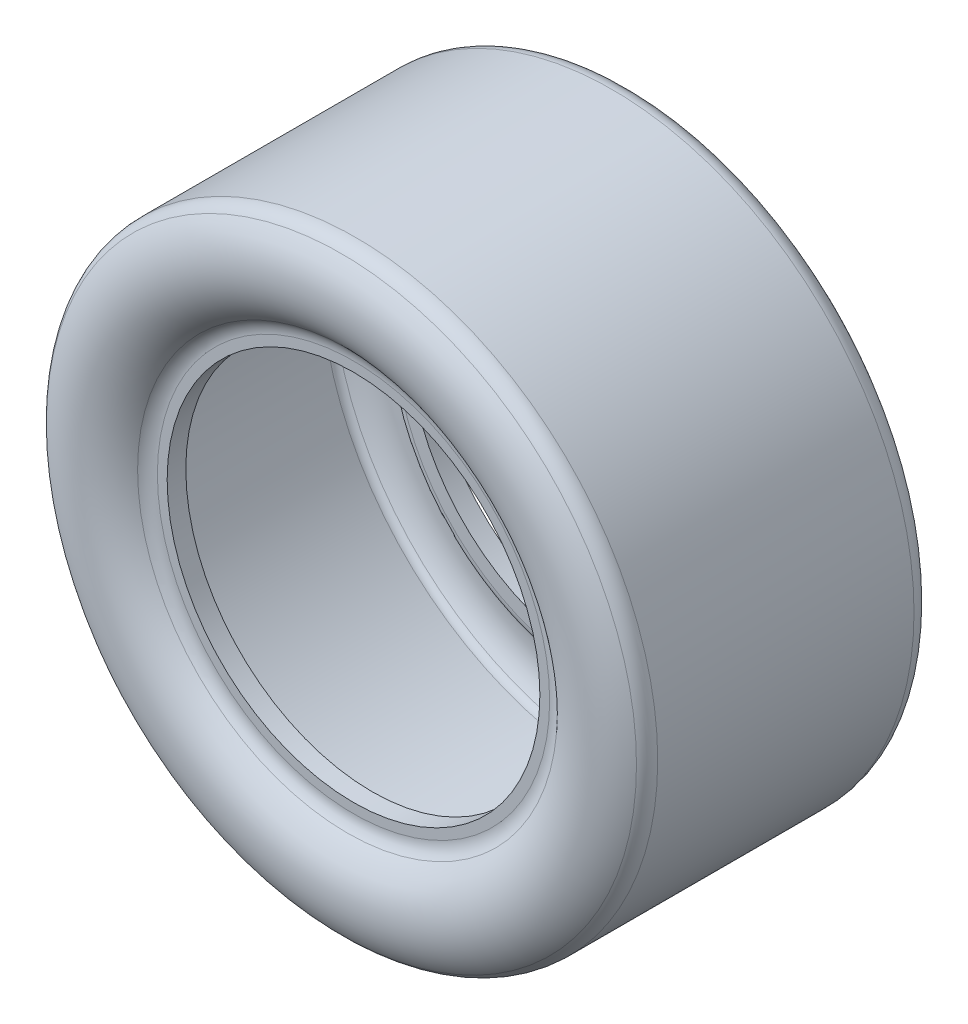
ISO-10303-21;
HEADER;
FILE_DESCRIPTION(('STEP AP214'),'2;1');
FILE_NAME('part.step','',(''),(''),'','','');
FILE_SCHEMA(('AUTOMOTIVE_DESIGN { 1 0 10303 214 1 1 1 1 }'));
ENDSEC;
DATA;
#1=APPLICATION_CONTEXT('core data for automotive mechanical design processes');
#2=APPLICATION_PROTOCOL_DEFINITION('international standard','automotive_design',2000,#1);
#3=PRODUCT_CONTEXT('',#1,'mechanical');
#4=PRODUCT('Part','Part','',(#3));
#5=PRODUCT_RELATED_PRODUCT_CATEGORY('part','',(#4));
#6=PRODUCT_DEFINITION_FORMATION('','',#4);
#7=PRODUCT_DEFINITION_CONTEXT('part definition',#1,'design');
#8=PRODUCT_DEFINITION('design','',#6,#7);
#9=PRODUCT_DEFINITION_SHAPE('','',#8);
#10=(LENGTH_UNIT() NAMED_UNIT(*) SI_UNIT(.MILLI.,.METRE.));
#11=(NAMED_UNIT(*) PLANE_ANGLE_UNIT() SI_UNIT($,.RADIAN.));
#12=(NAMED_UNIT(*) SI_UNIT($,.STERADIAN.) SOLID_ANGLE_UNIT());
#13=UNCERTAINTY_MEASURE_WITH_UNIT(LENGTH_MEASURE(1.E-05),#10,'distance_accuracy_value','');
#14=(GEOMETRIC_REPRESENTATION_CONTEXT(3) GLOBAL_UNCERTAINTY_ASSIGNED_CONTEXT((#13)) GLOBAL_UNIT_ASSIGNED_CONTEXT((#10,
#11,#12)) REPRESENTATION_CONTEXT('',''));
#15=CARTESIAN_POINT('',(0.,0.,0.));
#16=DIRECTION('',(0.,0.,1.));
#17=DIRECTION('',(1.,0.,0.));
#18=AXIS2_PLACEMENT_3D('',#15,#16,#17);
#19=CARTESIAN_POINT('',(0.,0.,64.4017));
#20=DIRECTION('',(0.,0.,-1.));
#21=DIRECTION('',(-1.,0.,0.));
#22=AXIS2_PLACEMENT_3D('',#19,#20,#21);
#23=TOROIDAL_SURFACE('',#22,174.243267307692,42.3486011478618);
#24=CARTESIAN_POINT('',(0.,0.,97.1518352972636));
#25=DIRECTION('',(0.,0.,-1.));
#26=DIRECTION('',(-1.,0.,0.));
#27=AXIS2_PLACEMENT_3D('',#24,#25,#26);
#28=CIRCLE('',#27,201.091594205129);
#29=CARTESIAN_POINT('',(-201.091594205129,0.,97.1518352972636));
#30=VERTEX_POINT('',#29);
#31=EDGE_CURVE('E54',#30,#30,#28,.F.);
#32=ORIENTED_EDGE('',*,*,#31,.T.);
#33=EDGE_LOOP('',(#32));
#34=FACE_BOUND('',#33,.T.);
#35=CARTESIAN_POINT('',(0.,0.,93.0181577706021));
#36=DIRECTION('',(0.,0.,-1.));
#37=DIRECTION('',(-1.,0.,0.));
#38=AXIS2_PLACEMENT_3D('',#35,#36,#37);
#39=CIRCLE('',#38,143.026246888632);
#40=CARTESIAN_POINT('',(-143.026246888632,0.,93.0181577706021));
#41=VERTEX_POINT('',#40);
#42=EDGE_CURVE('E58',#41,#41,#39,.T.);
#43=ORIENTED_EDGE('',*,*,#42,.T.);
#44=EDGE_LOOP('',(#43));
#45=FACE_BOUND('',#44,.T.);
#46=ADVANCED_FACE('F43',(#34,#45),#23,.T.);
#47=CARTESIAN_POINT('',(0.,127.,88.9));
#48=DIRECTION('',(0.,0.,1.));
#49=DIRECTION('',(1.,0.,0.));
#50=AXIS2_PLACEMENT_3D('',#47,#48,#49);
#51=PLANE('',#50);
#52=CARTESIAN_POINT('',(0.,0.,88.9));
#53=DIRECTION('',(0.,0.,1.));
#54=DIRECTION('',(1.,0.,0.));
#55=AXIS2_PLACEMENT_3D('',#52,#53,#54);
#56=CIRCLE('',#55,133.664517136619);
#57=CARTESIAN_POINT('',(133.664517136619,0.,88.9));
#58=VERTEX_POINT('',#57);
#59=EDGE_CURVE('E10',#58,#58,#56,.T.);
#60=ORIENTED_EDGE('',*,*,#59,.T.);
#61=EDGE_LOOP('',(#60));
#62=FACE_BOUND('',#61,.T.);
#63=CARTESIAN_POINT('',(0.,0.,88.9));
#64=DIRECTION('',(0.,0.,-1.));
#65=DIRECTION('',(-1.,0.,0.));
#66=AXIS2_PLACEMENT_3D('',#63,#64,#65);
#67=CIRCLE('',#66,127.);
#68=CARTESIAN_POINT('',(-127.,0.,88.9));
#69=VERTEX_POINT('',#68);
#70=EDGE_CURVE('E75',#69,#69,#67,.T.);
#71=ORIENTED_EDGE('',*,*,#70,.T.);
#72=EDGE_LOOP('',(#71));
#73=FACE_BOUND('',#72,.T.);
#74=ADVANCED_FACE('F130',(#62,#73),#51,.T.);
#75=CARTESIAN_POINT('',(0.,0.,0.));
#76=DIRECTION('',(0.,0.,-1.));
#77=DIRECTION('',(-1.,0.,0.));
#78=AXIS2_PLACEMENT_3D('',#75,#76,#77);
#79=CYLINDRICAL_SURFACE('',#78,127.);
#80=CARTESIAN_POINT('',(0.,0.,76.2));
#81=DIRECTION('',(0.,0.,-1.));
#82=DIRECTION('',(-1.,0.,0.));
#83=AXIS2_PLACEMENT_3D('',#80,#81,#82);
#84=CIRCLE('',#83,127.);
#85=CARTESIAN_POINT('',(-127.,0.,76.2));
#86=VERTEX_POINT('',#85);
#87=EDGE_CURVE('E78',#86,#86,#84,.T.);
#88=ORIENTED_EDGE('',*,*,#87,.T.);
#89=EDGE_LOOP('',(#88));
#90=FACE_BOUND('',#89,.T.);
#91=ORIENTED_EDGE('',*,*,#70,.F.);
#92=EDGE_LOOP('',(#91));
#93=FACE_BOUND('',#92,.T.);
#94=ADVANCED_FACE('F135',(#90,#93),#79,.F.);
#95=CARTESIAN_POINT('',(0.,127.,76.2));
#96=DIRECTION('',(0.,0.,-1.));
#97=DIRECTION('',(-1.,0.,0.));
#98=AXIS2_PLACEMENT_3D('',#95,#96,#97);
#99=PLANE('',#98);
#100=CARTESIAN_POINT('',(0.,0.,76.2));
#101=DIRECTION('',(0.,0.,-1.));
#102=DIRECTION('',(-1.,0.,0.));
#103=AXIS2_PLACEMENT_3D('',#100,#101,#102);
#104=CIRCLE('',#103,136.774584150412);
#105=CARTESIAN_POINT('',(-136.774584150412,0.,76.2));
#106=VERTEX_POINT('',#105);
#107=EDGE_CURVE('E81',#106,#106,#104,.T.);
#108=ORIENTED_EDGE('',*,*,#107,.T.);
#109=EDGE_LOOP('',(#108));
#110=FACE_BOUND('',#109,.T.);
#111=ORIENTED_EDGE('',*,*,#87,.F.);
#112=EDGE_LOOP('',(#111));
#113=FACE_BOUND('',#112,.T.);
#114=ADVANCED_FACE('F251',(#110,#113),#99,.T.);
#115=CARTESIAN_POINT('',(0.,0.,84.1375));
#116=DIRECTION('',(0.,0.,-1.));
#117=DIRECTION('',(-1.,0.,0.));
#118=AXIS2_PLACEMENT_3D('',#115,#116,#117);
#119=TOROIDAL_SURFACE('',#118,136.774584150412,7.93749999999999);
#120=CARTESIAN_POINT('',(0.,0.,80.4383716166789));
#121=DIRECTION('',(0.,0.,-1.));
#122=DIRECTION('',(-1.,0.,0.));
#123=AXIS2_PLACEMENT_3D('',#120,#121,#122);
#124=CIRCLE('',#123,143.797429403848);
#125=CARTESIAN_POINT('',(-143.797429403848,0.,80.4383716166789));
#126=VERTEX_POINT('',#125);
#127=EDGE_CURVE('E84',#126,#126,#124,.T.);
#128=ORIENTED_EDGE('',*,*,#127,.T.);
#129=EDGE_LOOP('',(#128));
#130=FACE_BOUND('',#129,.T.);
#131=ORIENTED_EDGE('',*,*,#107,.F.);
#132=EDGE_LOOP('',(#131));
#133=FACE_BOUND('',#132,.T.);
#134=ADVANCED_FACE('F243',(#130,#133),#119,.T.);
#135=CARTESIAN_POINT('',(0.,0.,64.4017));
#136=DIRECTION('',(0.,0.,-1.));
#137=DIRECTION('',(-1.,0.,0.));
#138=AXIS2_PLACEMENT_3D('',#135,#136,#137);
#139=TOROIDAL_SURFACE('',#138,174.243267307692,34.4111011478618);
#140=CARTESIAN_POINT('',(0.,0.,91.5819201400496));
#141=DIRECTION('',(0.,0.,-1.));
#142=DIRECTION('',(-1.,0.,0.));
#143=AXIS2_PLACEMENT_3D('',#140,#141,#142);
#144=CIRCLE('',#143,195.346810027976);
#145=CARTESIAN_POINT('',(-195.346810027976,0.,91.5819201400496));
#146=VERTEX_POINT('',#145);
#147=EDGE_CURVE('E87',#146,#146,#144,.T.);
#148=ORIENTED_EDGE('',*,*,#147,.T.);
#149=EDGE_LOOP('',(#148));
#150=FACE_BOUND('',#149,.T.);
#151=ORIENTED_EDGE('',*,*,#127,.F.);
#152=EDGE_LOOP('',(#151));
#153=FACE_BOUND('',#152,.T.);
#154=ADVANCED_FACE('F235',(#150,#153),#139,.F.);
#155=CARTESIAN_POINT('',(0.,0.,86.5662597243108));
#156=DIRECTION('',(0.,0.,-1.));
#157=DIRECTION('',(-1.,0.,0.));
#158=AXIS2_PLACEMENT_3D('',#155,#156,#157);
#159=TOROIDAL_SURFACE('',#158,191.4525,6.35000000000001);
#160=CARTESIAN_POINT('',(0.,0.,86.5662597243108));
#161=DIRECTION('',(0.,0.,-1.));
#162=DIRECTION('',(-1.,0.,0.));
#163=AXIS2_PLACEMENT_3D('',#160,#161,#162);
#164=CIRCLE('',#163,197.8025);
#165=CARTESIAN_POINT('',(-197.8025,0.,86.5662597243108));
#166=VERTEX_POINT('',#165);
#167=EDGE_CURVE('E90',#166,#166,#164,.T.);
#168=ORIENTED_EDGE('',*,*,#167,.T.);
#169=EDGE_LOOP('',(#168));
#170=FACE_BOUND('',#169,.T.);
#171=ORIENTED_EDGE('',*,*,#147,.F.);
#172=EDGE_LOOP('',(#171));
#173=FACE_BOUND('',#172,.T.);
#174=ADVANCED_FACE('F227',(#170,#173),#159,.F.);
#175=CARTESIAN_POINT('',(0.,0.,0.));
#176=DIRECTION('',(0.,0.,-1.));
#177=DIRECTION('',(-1.,0.,0.));
#178=AXIS2_PLACEMENT_3D('',#175,#176,#177);
#179=CYLINDRICAL_SURFACE('',#178,197.8025);
#180=CARTESIAN_POINT('',(0.,0.,-86.5662597243108));
#181=DIRECTION('',(0.,0.,-1.));
#182=DIRECTION('',(-1.,0.,0.));
#183=AXIS2_PLACEMENT_3D('',#180,#181,#182);
#184=CIRCLE('',#183,197.8025);
#185=CARTESIAN_POINT('',(-197.8025,0.,-86.5662597243108));
#186=VERTEX_POINT('',#185);
#187=EDGE_CURVE('E93',#186,#186,#184,.T.);
#188=ORIENTED_EDGE('',*,*,#187,.T.);
#189=EDGE_LOOP('',(#188));
#190=FACE_BOUND('',#189,.T.);
#191=ORIENTED_EDGE('',*,*,#167,.F.);
#192=EDGE_LOOP('',(#191));
#193=FACE_BOUND('',#192,.T.);
#194=ADVANCED_FACE('F219',(#190,#193),#179,.F.);
#195=CARTESIAN_POINT('',(0.,0.,-86.5662597243107));
#196=DIRECTION('',(0.,0.,-1.));
#197=DIRECTION('',(-1.,0.,0.));
#198=AXIS2_PLACEMENT_3D('',#195,#196,#197);
#199=TOROIDAL_SURFACE('',#198,191.4525,6.35000000000012);
#200=CARTESIAN_POINT('',(0.,0.,-91.5819201400496));
#201=DIRECTION('',(0.,0.,-1.));
#202=DIRECTION('',(-1.,0.,0.));
#203=AXIS2_PLACEMENT_3D('',#200,#201,#202);
#204=CIRCLE('',#203,195.346810027975);
#205=CARTESIAN_POINT('',(-195.346810027975,0.,-91.5819201400496));
#206=VERTEX_POINT('',#205);
#207=EDGE_CURVE('E96',#206,#206,#204,.T.);
#208=ORIENTED_EDGE('',*,*,#207,.T.);
#209=EDGE_LOOP('',(#208));
#210=FACE_BOUND('',#209,.T.);
#211=ORIENTED_EDGE('',*,*,#187,.F.);
#212=EDGE_LOOP('',(#211));
#213=FACE_BOUND('',#212,.T.);
#214=ADVANCED_FACE('F211',(#210,#213),#199,.F.);
#215=CARTESIAN_POINT('',(0.,0.,-64.4017));
#216=DIRECTION('',(0.,0.,-1.));
#217=DIRECTION('',(-1.,0.,0.));
#218=AXIS2_PLACEMENT_3D('',#215,#216,#217);
#219=TOROIDAL_SURFACE('',#218,174.243267307692,34.4111011478618);
#220=CARTESIAN_POINT('',(0.,0.,-80.4383716166789));
#221=DIRECTION('',(0.,0.,-1.));
#222=DIRECTION('',(-1.,0.,0.));
#223=AXIS2_PLACEMENT_3D('',#220,#221,#222);
#224=CIRCLE('',#223,143.797429403848);
#225=CARTESIAN_POINT('',(-143.797429403848,0.,-80.4383716166789));
#226=VERTEX_POINT('',#225);
#227=EDGE_CURVE('E99',#226,#226,#224,.T.);
#228=ORIENTED_EDGE('',*,*,#227,.T.);
#229=EDGE_LOOP('',(#228));
#230=FACE_BOUND('',#229,.T.);
#231=ORIENTED_EDGE('',*,*,#207,.F.);
#232=EDGE_LOOP('',(#231));
#233=FACE_BOUND('',#232,.T.);
#234=ADVANCED_FACE('F203',(#230,#233),#219,.F.);
#235=CARTESIAN_POINT('',(0.,0.,-84.1375));
#236=DIRECTION('',(0.,0.,-1.));
#237=DIRECTION('',(-1.,0.,0.));
#238=AXIS2_PLACEMENT_3D('',#235,#236,#237);
#239=TOROIDAL_SURFACE('',#238,136.774584150412,7.93749999999999);
#240=CARTESIAN_POINT('',(0.,0.,-76.2));
#241=DIRECTION('',(0.,0.,-1.));
#242=DIRECTION('',(-1.,0.,0.));
#243=AXIS2_PLACEMENT_3D('',#240,#241,#242);
#244=CIRCLE('',#243,136.774584150412);
#245=CARTESIAN_POINT('',(-136.774584150412,0.,-76.2));
#246=VERTEX_POINT('',#245);
#247=EDGE_CURVE('E102',#246,#246,#244,.T.);
#248=ORIENTED_EDGE('',*,*,#247,.T.);
#249=EDGE_LOOP('',(#248));
#250=FACE_BOUND('',#249,.T.);
#251=ORIENTED_EDGE('',*,*,#227,.F.);
#252=EDGE_LOOP('',(#251));
#253=FACE_BOUND('',#252,.T.);
#254=ADVANCED_FACE('F195',(#250,#253),#239,.T.);
#255=CARTESIAN_POINT('',(0.,127.,-76.2));
#256=DIRECTION('',(0.,0.,1.));
#257=DIRECTION('',(1.,0.,0.));
#258=AXIS2_PLACEMENT_3D('',#255,#256,#257);
#259=PLANE('',#258);
#260=CARTESIAN_POINT('',(0.,0.,-76.2));
#261=DIRECTION('',(0.,0.,-1.));
#262=DIRECTION('',(-1.,0.,0.));
#263=AXIS2_PLACEMENT_3D('',#260,#261,#262);
#264=CIRCLE('',#263,127.);
#265=CARTESIAN_POINT('',(-127.,0.,-76.2));
#266=VERTEX_POINT('',#265);
#267=EDGE_CURVE('E105',#266,#266,#264,.T.);
#268=ORIENTED_EDGE('',*,*,#267,.T.);
#269=EDGE_LOOP('',(#268));
#270=FACE_BOUND('',#269,.T.);
#271=ORIENTED_EDGE('',*,*,#247,.F.);
#272=EDGE_LOOP('',(#271));
#273=FACE_BOUND('',#272,.T.);
#274=ADVANCED_FACE('F127',(#270,#273),#259,.T.);
#275=CARTESIAN_POINT('',(0.,0.,0.));
#276=DIRECTION('',(0.,0.,-1.));
#277=DIRECTION('',(-1.,0.,0.));
#278=AXIS2_PLACEMENT_3D('',#275,#276,#277);
#279=CYLINDRICAL_SURFACE('',#278,127.);
#280=CARTESIAN_POINT('',(0.,0.,-88.9));
#281=DIRECTION('',(0.,0.,-1.));
#282=DIRECTION('',(-1.,0.,0.));
#283=AXIS2_PLACEMENT_3D('',#280,#281,#282);
#284=CIRCLE('',#283,127.);
#285=CARTESIAN_POINT('',(-127.,0.,-88.9));
#286=VERTEX_POINT('',#285);
#287=EDGE_CURVE('E108',#286,#286,#284,.T.);
#288=ORIENTED_EDGE('',*,*,#287,.T.);
#289=EDGE_LOOP('',(#288));
#290=FACE_BOUND('',#289,.T.);
#291=ORIENTED_EDGE('',*,*,#267,.F.);
#292=EDGE_LOOP('',(#291));
#293=FACE_BOUND('',#292,.T.);
#294=ADVANCED_FACE('F112',(#290,#293),#279,.F.);
#295=CARTESIAN_POINT('',(0.,127.,-88.9));
#296=DIRECTION('',(0.,0.,-1.));
#297=DIRECTION('',(-1.,0.,0.));
#298=AXIS2_PLACEMENT_3D('',#295,#296,#297);
#299=PLANE('',#298);
#300=CARTESIAN_POINT('',(0.,0.,-88.9));
#301=DIRECTION('',(0.,0.,-1.));
#302=DIRECTION('',(-1.,0.,0.));
#303=AXIS2_PLACEMENT_3D('',#300,#301,#302);
#304=CIRCLE('',#303,133.664517136619);
#305=CARTESIAN_POINT('',(-133.664517136619,0.,-88.9));
#306=VERTEX_POINT('',#305);
#307=EDGE_CURVE('E50',#306,#306,#304,.T.);
#308=ORIENTED_EDGE('',*,*,#307,.T.);
#309=EDGE_LOOP('',(#308));
#310=FACE_BOUND('',#309,.T.);
#311=ORIENTED_EDGE('',*,*,#287,.F.);
#312=EDGE_LOOP('',(#311));
#313=FACE_BOUND('',#312,.T.);
#314=ADVANCED_FACE('F115',(#310,#313),#299,.T.);
#315=CARTESIAN_POINT('',(0.,0.,-64.4017));
#316=DIRECTION('',(0.,0.,-1.));
#317=DIRECTION('',(-1.,0.,0.));
#318=AXIS2_PLACEMENT_3D('',#315,#316,#317);
#319=TOROIDAL_SURFACE('',#318,174.243267307692,42.3486011478618);
#320=CARTESIAN_POINT('',(0.,0.,-97.1518352972635));
#321=DIRECTION('',(0.,0.,1.));
#322=DIRECTION('',(1.,0.,0.));
#323=AXIS2_PLACEMENT_3D('',#320,#321,#322);
#324=CIRCLE('',#323,201.091594205129);
#325=CARTESIAN_POINT('',(201.091594205129,0.,-97.1518352972635));
#326=VERTEX_POINT('',#325);
#327=EDGE_CURVE('E69',#326,#326,#324,.F.);
#328=ORIENTED_EDGE('',*,*,#327,.T.);
#329=EDGE_LOOP('',(#328));
#330=FACE_BOUND('',#329,.T.);
#331=CARTESIAN_POINT('',(0.,0.,-93.0181577706021));
#332=DIRECTION('',(0.,0.,1.));
#333=DIRECTION('',(1.,0.,0.));
#334=AXIS2_PLACEMENT_3D('',#331,#332,#333);
#335=CIRCLE('',#334,143.026246888632);
#336=CARTESIAN_POINT('',(143.026246888632,0.,-93.0181577706021));
#337=VERTEX_POINT('',#336);
#338=EDGE_CURVE('E72',#337,#337,#335,.T.);
#339=ORIENTED_EDGE('',*,*,#338,.T.);
#340=EDGE_LOOP('',(#339));
#341=FACE_BOUND('',#340,.T.);
#342=ADVANCED_FACE('F117',(#330,#341),#319,.T.);
#343=CARTESIAN_POINT('',(0.,0.,0.));
#344=DIRECTION('',(0.,0.,-1.));
#345=DIRECTION('',(-1.,0.,0.));
#346=AXIS2_PLACEMENT_3D('',#343,#344,#345);
#347=CYLINDRICAL_SURFACE('',#346,205.74);
#348=CARTESIAN_POINT('',(0.,0.,-87.3303369005862));
#349=DIRECTION('',(0.,0.,1.));
#350=DIRECTION('',(1.,0.,0.));
#351=AXIS2_PLACEMENT_3D('',#348,#349,#350);
#352=CIRCLE('',#351,205.74);
#353=CARTESIAN_POINT('',(205.74,0.,-87.3303369005862));
#354=VERTEX_POINT('',#353);
#355=EDGE_CURVE('E63',#354,#354,#352,.T.);
#356=ORIENTED_EDGE('',*,*,#355,.T.);
#357=EDGE_LOOP('',(#356));
#358=FACE_BOUND('',#357,.T.);
#359=CARTESIAN_POINT('',(0.,0.,87.3303369005863));
#360=DIRECTION('',(0.,0.,1.));
#361=DIRECTION('',(1.,0.,0.));
#362=AXIS2_PLACEMENT_3D('',#359,#360,#361);
#363=CIRCLE('',#362,205.74);
#364=CARTESIAN_POINT('',(205.74,0.,87.3303369005863));
#365=VERTEX_POINT('',#364);
#366=EDGE_CURVE('E66',#365,#365,#363,.F.);
#367=ORIENTED_EDGE('',*,*,#366,.T.);
#368=EDGE_LOOP('',(#367));
#369=FACE_BOUND('',#368,.T.);
#370=ADVANCED_FACE('F123',(#358,#369),#347,.T.);
#371=CARTESIAN_POINT('',(0.,0.,-87.3303369005862));
#372=DIRECTION('',(0.,0.,1.));
#373=DIRECTION('',(1.,0.,0.));
#374=AXIS2_PLACEMENT_3D('',#371,#372,#373);
#375=TOROIDAL_SURFACE('',#374,193.04,12.7);
#376=ORIENTED_EDGE('',*,*,#355,.F.);
#377=EDGE_LOOP('',(#376));
#378=FACE_BOUND('',#377,.T.);
#379=ORIENTED_EDGE('',*,*,#327,.F.);
#380=EDGE_LOOP('',(#379));
#381=FACE_BOUND('',#380,.T.);
#382=ADVANCED_FACE('F140',(#378,#381),#375,.T.);
#383=CARTESIAN_POINT('',(0.,0.,87.3303369005863));
#384=DIRECTION('',(0.,0.,1.));
#385=DIRECTION('',(1.,0.,0.));
#386=AXIS2_PLACEMENT_3D('',#383,#384,#385);
#387=TOROIDAL_SURFACE('',#386,193.04,12.7);
#388=ORIENTED_EDGE('',*,*,#31,.F.);
#389=EDGE_LOOP('',(#388));
#390=FACE_BOUND('',#389,.T.);
#391=ORIENTED_EDGE('',*,*,#366,.F.);
#392=EDGE_LOOP('',(#391));
#393=FACE_BOUND('',#392,.T.);
#394=ADVANCED_FACE('F143',(#390,#393),#387,.T.);
#395=CARTESIAN_POINT('',(0.,0.,-101.6));
#396=DIRECTION('',(0.,0.,1.));
#397=DIRECTION('',(1.,0.,0.));
#398=AXIS2_PLACEMENT_3D('',#395,#396,#397);
#399=TOROIDAL_SURFACE('',#398,133.664517136619,12.7);
#400=ORIENTED_EDGE('',*,*,#338,.F.);
#401=EDGE_LOOP('',(#400));
#402=FACE_BOUND('',#401,.T.);
#403=ORIENTED_EDGE('',*,*,#307,.F.);
#404=EDGE_LOOP('',(#403));
#405=FACE_BOUND('',#404,.T.);
#406=ADVANCED_FACE('F146',(#402,#405),#399,.F.);
#407=CARTESIAN_POINT('',(0.,0.,101.6));
#408=DIRECTION('',(0.,0.,-1.));
#409=DIRECTION('',(-1.,0.,0.));
#410=AXIS2_PLACEMENT_3D('',#407,#408,#409);
#411=TOROIDAL_SURFACE('',#410,133.664517136619,12.7);
#412=ORIENTED_EDGE('',*,*,#59,.F.);
#413=EDGE_LOOP('',(#412));
#414=FACE_BOUND('',#413,.T.);
#415=ORIENTED_EDGE('',*,*,#42,.F.);
#416=EDGE_LOOP('',(#415));
#417=FACE_BOUND('',#416,.T.);
#418=ADVANCED_FACE('F45',(#414,#417),#411,.F.);
#419=CLOSED_SHELL('',(#46,#74,#94,#114,#134,#154,#174,#194,#214,#234,#254,#274,#294,#314,#342,
#370,#382,#394,#406,#418));
#420=MANIFOLD_SOLID_BREP('B2',#419);
#421=ADVANCED_BREP_SHAPE_REPRESENTATION('',(#18,#420),#14);
#422=SHAPE_DEFINITION_REPRESENTATION(#9,#421);
ENDSEC;
END-ISO-10303-21;
